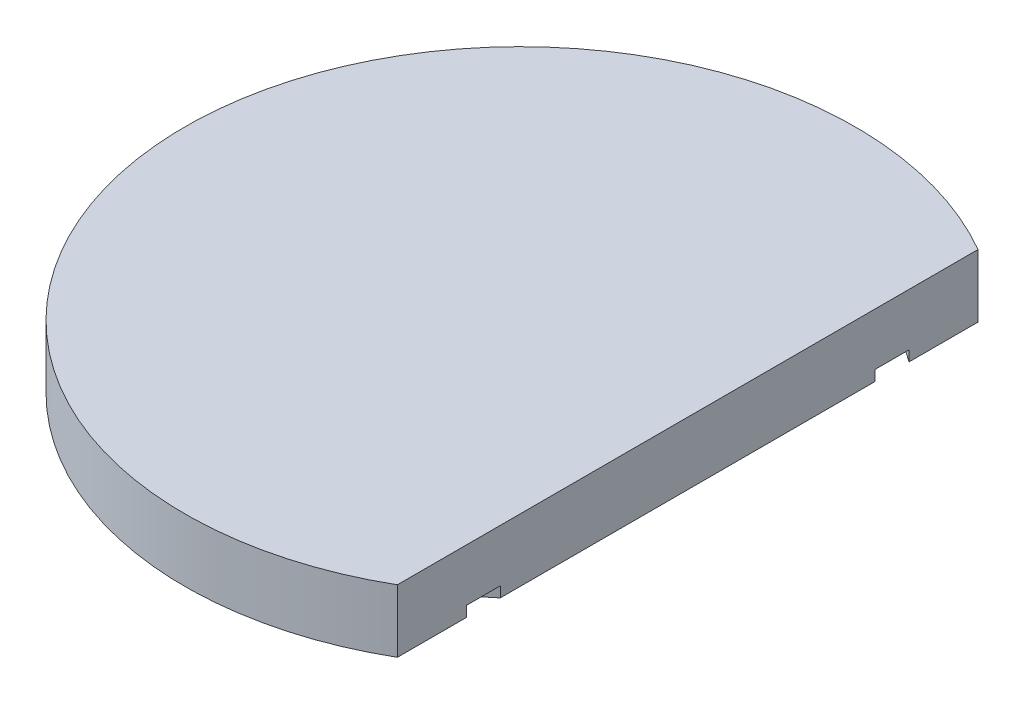
ISO-10303-21;
HEADER;
FILE_DESCRIPTION(('STEP AP214'),'2;1');
FILE_NAME('part.step','',(''),(''),'','','');
FILE_SCHEMA(('AUTOMOTIVE_DESIGN { 1 0 10303 214 1 1 1 1 }'));
ENDSEC;
DATA;
#1=APPLICATION_CONTEXT('core data for automotive mechanical design processes');
#2=APPLICATION_PROTOCOL_DEFINITION('international standard','automotive_design',2000,#1);
#3=PRODUCT_CONTEXT('',#1,'mechanical');
#4=PRODUCT('Part','Part','',(#3));
#5=PRODUCT_RELATED_PRODUCT_CATEGORY('part','',(#4));
#6=PRODUCT_DEFINITION_FORMATION('','',#4);
#7=PRODUCT_DEFINITION_CONTEXT('part definition',#1,'design');
#8=PRODUCT_DEFINITION('design','',#6,#7);
#9=PRODUCT_DEFINITION_SHAPE('','',#8);
#10=(LENGTH_UNIT() NAMED_UNIT(*) SI_UNIT(.MILLI.,.METRE.));
#11=(NAMED_UNIT(*) PLANE_ANGLE_UNIT() SI_UNIT($,.RADIAN.));
#12=(NAMED_UNIT(*) SI_UNIT($,.STERADIAN.) SOLID_ANGLE_UNIT());
#13=UNCERTAINTY_MEASURE_WITH_UNIT(LENGTH_MEASURE(1.E-05),#10,'distance_accuracy_value','');
#14=(GEOMETRIC_REPRESENTATION_CONTEXT(3) GLOBAL_UNCERTAINTY_ASSIGNED_CONTEXT((#13)) GLOBAL_UNIT_ASSIGNED_CONTEXT((#10,
#11,#12)) REPRESENTATION_CONTEXT('',''));
#15=CARTESIAN_POINT('',(0.,0.,0.));
#16=DIRECTION('',(0.,0.,1.));
#17=DIRECTION('',(1.,0.,0.));
#18=AXIS2_PLACEMENT_3D('',#15,#16,#17);
#19=CARTESIAN_POINT('',(0.,0.,0.));
#20=DIRECTION('',(0.,1.,0.));
#21=DIRECTION('',(0.,0.,1.));
#22=AXIS2_PLACEMENT_3D('',#19,#20,#21);
#23=PLANE('',#22);
#24=CARTESIAN_POINT('',(0.,0.,0.));
#25=DIRECTION('',(0.,1.,0.));
#26=DIRECTION('',(0.,0.,1.));
#27=AXIS2_PLACEMENT_3D('',#24,#25,#26);
#28=CIRCLE('',#27,76.2);
#29=CARTESIAN_POINT('',(50.8,0.,-56.7961266284946));
#30=VERTEX_POINT('',#29);
#31=CARTESIAN_POINT('',(50.8,0.,56.7961266284946));
#32=VERTEX_POINT('',#31);
#33=EDGE_CURVE('E101',#30,#32,#28,.T.);
#34=ORIENTED_EDGE('',*,*,#33,.F.);
#35=DIRECTION('',(0.,0.,-1.));
#36=VECTOR('',#35,1.);
#37=CARTESIAN_POINT('',(50.8,0.,87.988181024499));
#38=LINE('',#37,#36);
#39=EDGE_CURVE('E81',#32,#30,#38,.T.);
#40=ORIENTED_EDGE('',*,*,#39,.F.);
#41=EDGE_LOOP('',(#34,#40));
#42=FACE_BOUND('',#41,.T.);
#43=ADVANCED_FACE('F33',(#42),#23,.F.);
#44=CARTESIAN_POINT('',(0.,19.05,0.));
#45=DIRECTION('',(0.,-1.,0.));
#46=DIRECTION('',(0.,0.,-1.));
#47=AXIS2_PLACEMENT_3D('',#44,#45,#46);
#48=CYLINDRICAL_SURFACE('',#47,101.6);
#49=CARTESIAN_POINT('',(0.,0.,0.));
#50=DIRECTION('',(0.,1.,0.));
#51=DIRECTION('',(0.,0.,1.));
#52=AXIS2_PLACEMENT_3D('',#49,#50,#51);
#53=CIRCLE('',#52,101.6);
#54=CARTESIAN_POINT('',(50.8,0.,-87.988181024499));
#55=VERTEX_POINT('',#54);
#56=CARTESIAN_POINT('',(50.8,0.,87.988181024499));
#57=VERTEX_POINT('',#56);
#58=EDGE_CURVE('E82',#55,#57,#53,.T.);
#59=ORIENTED_EDGE('',*,*,#58,.T.);
#60=DIRECTION('',(0.,-1.,0.));
#61=VECTOR('',#60,1.);
#62=CARTESIAN_POINT('',(50.8,19.05,87.988181024499));
#63=LINE('',#62,#61);
#64=CARTESIAN_POINT('',(50.8,19.05,87.988181024499));
#65=VERTEX_POINT('',#64);
#66=EDGE_CURVE('E89',#65,#57,#63,.T.);
#67=ORIENTED_EDGE('',*,*,#66,.F.);
#68=CARTESIAN_POINT('',(0.,19.05,0.));
#69=DIRECTION('',(0.,1.,0.));
#70=DIRECTION('',(0.,0.,1.));
#71=AXIS2_PLACEMENT_3D('',#68,#69,#70);
#72=CIRCLE('',#71,101.6);
#73=CARTESIAN_POINT('',(50.8,19.05,-87.988181024499));
#74=VERTEX_POINT('',#73);
#75=EDGE_CURVE('E88',#74,#65,#72,.T.);
#76=ORIENTED_EDGE('',*,*,#75,.F.);
#77=DIRECTION('',(0.,-1.,0.));
#78=VECTOR('',#77,1.);
#79=CARTESIAN_POINT('',(50.8,19.05,-87.988181024499));
#80=LINE('',#79,#78);
#81=EDGE_CURVE('E73',#74,#55,#80,.T.);
#82=ORIENTED_EDGE('',*,*,#81,.T.);
#83=EDGE_LOOP('',(#59,#67,#76,#82));
#84=FACE_BOUND('',#83,.T.);
#85=ADVANCED_FACE('F35',(#84),#48,.T.);
#86=CARTESIAN_POINT('',(50.8,19.05,87.988181024499));
#87=DIRECTION('',(-1.,0.,0.));
#88=DIRECTION('',(0.,0.,1.));
#89=AXIS2_PLACEMENT_3D('',#86,#87,#88);
#90=PLANE('',#89);
#91=DIRECTION('',(0.,0.,1.));
#92=VECTOR('',#91,1.);
#93=CARTESIAN_POINT('',(50.8,3.175,87.988181024499));
#94=LINE('',#93,#92);
#95=CARTESIAN_POINT('',(50.8,3.175,-67.0707008033314));
#96=VERTEX_POINT('',#95);
#97=CARTESIAN_POINT('',(50.8,3.175,-56.7961266284947));
#98=VERTEX_POINT('',#97);
#99=EDGE_CURVE('E11',#96,#98,#94,.T.);
#100=ORIENTED_EDGE('',*,*,#99,.F.);
#101=DIRECTION('',(0.,-1.,0.));
#102=VECTOR('',#101,1.);
#103=CARTESIAN_POINT('',(50.8,3.175,-67.0707008033314));
#104=LINE('',#103,#102);
#105=CARTESIAN_POINT('',(50.8,0.,-67.0707008033314));
#106=VERTEX_POINT('',#105);
#107=EDGE_CURVE('E77',#96,#106,#104,.T.);
#108=ORIENTED_EDGE('',*,*,#107,.T.);
#109=EDGE_CURVE('E69',#106,#55,#38,.T.);
#110=ORIENTED_EDGE('',*,*,#109,.T.);
#111=ORIENTED_EDGE('',*,*,#81,.F.);
#112=DIRECTION('',(0.,0.,-1.));
#113=VECTOR('',#112,1.);
#114=CARTESIAN_POINT('',(50.8,19.05,87.988181024499));
#115=LINE('',#114,#113);
#116=EDGE_CURVE('E56',#65,#74,#115,.T.);
#117=ORIENTED_EDGE('',*,*,#116,.F.);
#118=ORIENTED_EDGE('',*,*,#66,.T.);
#119=CARTESIAN_POINT('',(50.8,0.,67.0707008033314));
#120=VERTEX_POINT('',#119);
#121=EDGE_CURVE('E84',#57,#120,#38,.T.);
#122=ORIENTED_EDGE('',*,*,#121,.T.);
#123=DIRECTION('',(0.,-1.,0.));
#124=VECTOR('',#123,1.);
#125=CARTESIAN_POINT('',(50.8,3.175,67.0707008033314));
#126=LINE('',#125,#124);
#127=CARTESIAN_POINT('',(50.8,3.175,67.0707008033314));
#128=VERTEX_POINT('',#127);
#129=EDGE_CURVE('E95',#120,#128,#126,.F.);
#130=ORIENTED_EDGE('',*,*,#129,.T.);
#131=CARTESIAN_POINT('',(50.8,3.175,56.7961266284947));
#132=VERTEX_POINT('',#131);
#133=EDGE_CURVE('E37',#132,#128,#94,.T.);
#134=ORIENTED_EDGE('',*,*,#133,.F.);
#135=DIRECTION('',(0.,-1.,0.));
#136=VECTOR('',#135,1.);
#137=CARTESIAN_POINT('',(50.8,3.175,56.7961266284947));
#138=LINE('',#137,#136);
#139=EDGE_CURVE('E122',#32,#132,#138,.F.);
#140=ORIENTED_EDGE('',*,*,#139,.F.);
#141=ORIENTED_EDGE('',*,*,#39,.T.);
#142=DIRECTION('',(0.,-1.,0.));
#143=VECTOR('',#142,1.);
#144=CARTESIAN_POINT('',(50.8,3.175,-56.7961266284947));
#145=LINE('',#144,#143);
#146=EDGE_CURVE('E48',#98,#30,#145,.T.);
#147=ORIENTED_EDGE('',*,*,#146,.F.);
#148=EDGE_LOOP('',(#100,#108,#110,#111,#117,#118,#122,#130,#134,#140,#141,#147));
#149=FACE_BOUND('',#148,.T.);
#150=ADVANCED_FACE('F72',(#149),#90,.F.);
#151=CARTESIAN_POINT('',(0.,19.05,0.));
#152=DIRECTION('',(0.,1.,0.));
#153=DIRECTION('',(0.,0.,1.));
#154=AXIS2_PLACEMENT_3D('',#151,#152,#153);
#155=PLANE('',#154);
#156=ORIENTED_EDGE('',*,*,#75,.T.);
#157=ORIENTED_EDGE('',*,*,#116,.T.);
#158=EDGE_LOOP('',(#156,#157));
#159=FACE_BOUND('',#158,.T.);
#160=ADVANCED_FACE('F127',(#159),#155,.T.);
#161=ORIENTED_EDGE('',*,*,#109,.F.);
#162=CARTESIAN_POINT('',(0.,0.,0.));
#163=DIRECTION('',(0.,1.,0.));
#164=DIRECTION('',(0.,0.,1.));
#165=AXIS2_PLACEMENT_3D('',#162,#163,#164);
#166=CIRCLE('',#165,84.1375);
#167=EDGE_CURVE('E102',#106,#120,#166,.T.);
#168=ORIENTED_EDGE('',*,*,#167,.T.);
#169=ORIENTED_EDGE('',*,*,#121,.F.);
#170=ORIENTED_EDGE('',*,*,#58,.F.);
#171=EDGE_LOOP('',(#161,#168,#169,#170));
#172=FACE_BOUND('',#171,.T.);
#173=ADVANCED_FACE('F91',(#172),#23,.F.);
#174=CARTESIAN_POINT('',(0.,3.175,0.));
#175=DIRECTION('',(0.,-1.,0.));
#176=DIRECTION('',(0.,0.,-1.));
#177=AXIS2_PLACEMENT_3D('',#174,#175,#176);
#178=PLANE('',#177);
#179=ORIENTED_EDGE('',*,*,#99,.T.);
#180=CARTESIAN_POINT('',(0.,3.175,0.));
#181=DIRECTION('',(0.,-1.,0.));
#182=DIRECTION('',(0.,0.,-1.));
#183=AXIS2_PLACEMENT_3D('',#180,#181,#182);
#184=CIRCLE('',#183,76.2);
#185=EDGE_CURVE('E115',#132,#98,#184,.T.);
#186=ORIENTED_EDGE('',*,*,#185,.F.);
#187=ORIENTED_EDGE('',*,*,#133,.T.);
#188=CARTESIAN_POINT('',(0.,3.175,0.));
#189=DIRECTION('',(0.,-1.,0.));
#190=DIRECTION('',(0.,0.,-1.));
#191=AXIS2_PLACEMENT_3D('',#188,#189,#190);
#192=CIRCLE('',#191,84.1375);
#193=EDGE_CURVE('E113',#128,#96,#192,.T.);
#194=ORIENTED_EDGE('',*,*,#193,.T.);
#195=EDGE_LOOP('',(#179,#186,#187,#194));
#196=FACE_BOUND('',#195,.T.);
#197=ADVANCED_FACE('F111',(#196),#178,.T.);
#198=CARTESIAN_POINT('',(0.,3.175,0.));
#199=DIRECTION('',(0.,-1.,0.));
#200=DIRECTION('',(0.,0.,-1.));
#201=AXIS2_PLACEMENT_3D('',#198,#199,#200);
#202=CYLINDRICAL_SURFACE('',#201,84.1375);
#203=ORIENTED_EDGE('',*,*,#193,.F.);
#204=ORIENTED_EDGE('',*,*,#129,.F.);
#205=ORIENTED_EDGE('',*,*,#167,.F.);
#206=ORIENTED_EDGE('',*,*,#107,.F.);
#207=EDGE_LOOP('',(#203,#204,#205,#206));
#208=FACE_BOUND('',#207,.T.);
#209=ADVANCED_FACE('F121',(#208),#202,.F.);
#210=CARTESIAN_POINT('',(0.,3.175,0.));
#211=DIRECTION('',(0.,-1.,0.));
#212=DIRECTION('',(0.,0.,-1.));
#213=AXIS2_PLACEMENT_3D('',#210,#211,#212);
#214=CYLINDRICAL_SURFACE('',#213,76.2);
#215=ORIENTED_EDGE('',*,*,#146,.T.);
#216=ORIENTED_EDGE('',*,*,#33,.T.);
#217=ORIENTED_EDGE('',*,*,#139,.T.);
#218=ORIENTED_EDGE('',*,*,#185,.T.);
#219=EDGE_LOOP('',(#215,#216,#217,#218));
#220=FACE_BOUND('',#219,.T.);
#221=ADVANCED_FACE('F148',(#220),#214,.T.);
#222=CLOSED_SHELL('',(#43,#85,#150,#160,#173,#197,#209,#221));
#223=MANIFOLD_SOLID_BREP('B2',#222);
#224=ADVANCED_BREP_SHAPE_REPRESENTATION('',(#18,#223),#14);
#225=SHAPE_DEFINITION_REPRESENTATION(#9,#224);
ENDSEC;
END-ISO-10303-21;
